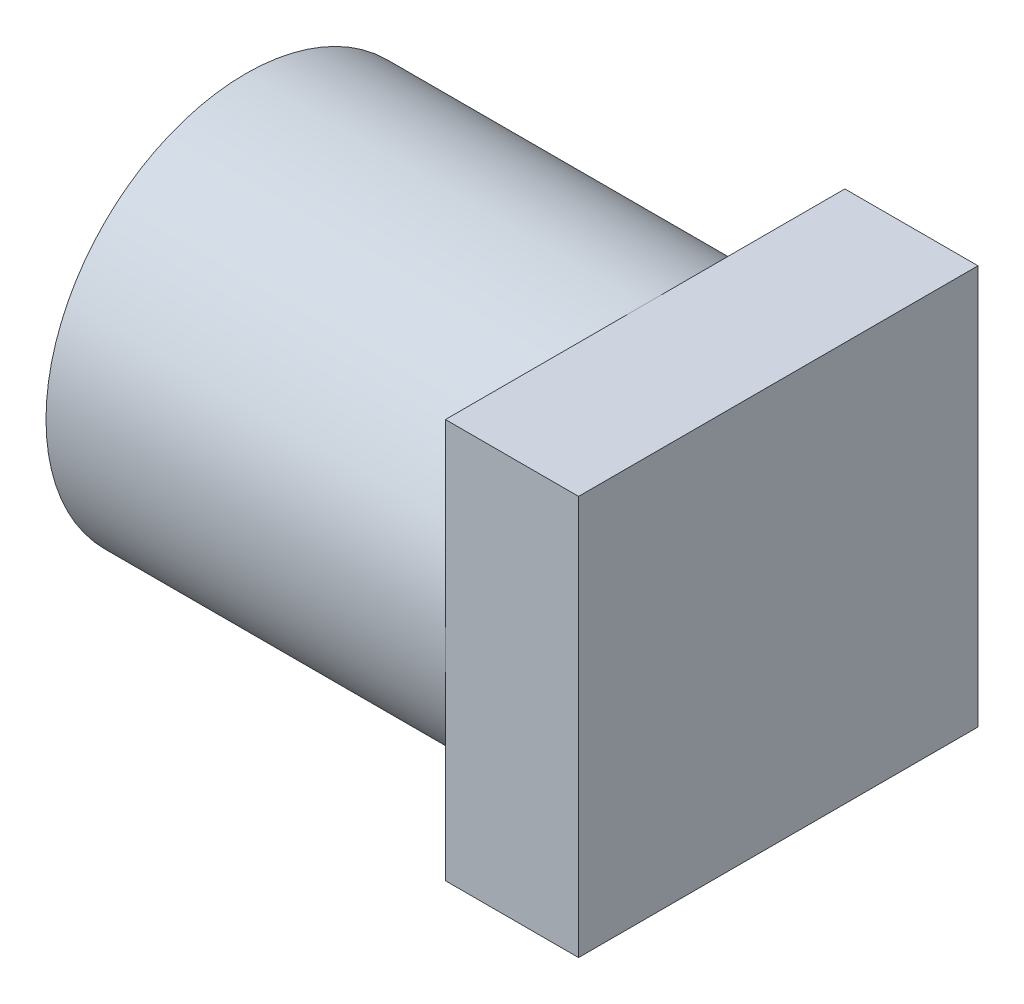
ISO-10303-21;
HEADER;
FILE_DESCRIPTION(('STEP AP214'),'2;1');
FILE_NAME('part.step','',(''),(''),'','','');
FILE_SCHEMA(('AUTOMOTIVE_DESIGN { 1 0 10303 214 1 1 1 1 }'));
ENDSEC;
DATA;
#1=APPLICATION_CONTEXT('core data for automotive mechanical design processes');
#2=APPLICATION_PROTOCOL_DEFINITION('international standard','automotive_design',2000,#1);
#3=PRODUCT_CONTEXT('',#1,'mechanical');
#4=PRODUCT('Part','Part','',(#3));
#5=PRODUCT_RELATED_PRODUCT_CATEGORY('part','',(#4));
#6=PRODUCT_DEFINITION_FORMATION('','',#4);
#7=PRODUCT_DEFINITION_CONTEXT('part definition',#1,'design');
#8=PRODUCT_DEFINITION('design','',#6,#7);
#9=PRODUCT_DEFINITION_SHAPE('','',#8);
#10=(LENGTH_UNIT() NAMED_UNIT(*) SI_UNIT(.MILLI.,.METRE.));
#11=(NAMED_UNIT(*) PLANE_ANGLE_UNIT() SI_UNIT($,.RADIAN.));
#12=(NAMED_UNIT(*) SI_UNIT($,.STERADIAN.) SOLID_ANGLE_UNIT());
#13=UNCERTAINTY_MEASURE_WITH_UNIT(LENGTH_MEASURE(1.E-05),#10,'distance_accuracy_value','');
#14=(GEOMETRIC_REPRESENTATION_CONTEXT(3) GLOBAL_UNCERTAINTY_ASSIGNED_CONTEXT((#13)) GLOBAL_UNIT_ASSIGNED_CONTEXT((#10,
#11,#12)) REPRESENTATION_CONTEXT('',''));
#15=CARTESIAN_POINT('',(0.,0.,0.));
#16=DIRECTION('',(0.,0.,1.));
#17=DIRECTION('',(1.,0.,0.));
#18=AXIS2_PLACEMENT_3D('',#15,#16,#17);
#19=CARTESIAN_POINT('',(30.,0.,0.));
#20=DIRECTION('',(-1.,0.,0.));
#21=DIRECTION('',(0.,0.,1.));
#22=AXIS2_PLACEMENT_3D('',#19,#20,#21);
#23=CYLINDRICAL_SURFACE('',#22,15.);
#24=CARTESIAN_POINT('',(30.,0.,0.));
#25=DIRECTION('',(1.,0.,0.));
#26=DIRECTION('',(0.,0.,-1.));
#27=AXIS2_PLACEMENT_3D('',#24,#25,#26);
#28=CIRCLE('',#27,15.);
#29=CARTESIAN_POINT('',(30.,0.,-15.));
#30=VERTEX_POINT('',#29);
#31=CARTESIAN_POINT('',(30.,15.,0.));
#32=VERTEX_POINT('',#31);
#33=EDGE_CURVE('E11',#30,#32,#28,.T.);
#34=ORIENTED_EDGE('',*,*,#33,.F.);
#35=CARTESIAN_POINT('',(30.,-15.,0.));
#36=VERTEX_POINT('',#35);
#37=EDGE_CURVE('E48',#36,#30,#28,.T.);
#38=ORIENTED_EDGE('',*,*,#37,.F.);
#39=CARTESIAN_POINT('',(30.,0.,15.));
#40=VERTEX_POINT('',#39);
#41=EDGE_CURVE('E58',#40,#36,#28,.T.);
#42=ORIENTED_EDGE('',*,*,#41,.F.);
#43=EDGE_CURVE('E47',#32,#40,#28,.T.);
#44=ORIENTED_EDGE('',*,*,#43,.F.);
#45=EDGE_LOOP('',(#34,#38,#42,#44));
#46=FACE_BOUND('',#45,.T.);
#47=CARTESIAN_POINT('',(0.,0.,0.));
#48=DIRECTION('',(1.,0.,0.));
#49=DIRECTION('',(0.,0.,-1.));
#50=AXIS2_PLACEMENT_3D('',#47,#48,#49);
#51=CIRCLE('',#50,15.);
#52=CARTESIAN_POINT('',(0.,0.,-15.));
#53=VERTEX_POINT('',#52);
#54=EDGE_CURVE('E42',#53,#53,#51,.T.);
#55=ORIENTED_EDGE('',*,*,#54,.T.);
#56=EDGE_LOOP('',(#55));
#57=FACE_BOUND('',#56,.T.);
#58=ADVANCED_FACE('F39',(#46,#57),#23,.T.);
#59=CARTESIAN_POINT('',(0.,0.,0.));
#60=DIRECTION('',(1.,0.,0.));
#61=DIRECTION('',(0.,0.,-1.));
#62=AXIS2_PLACEMENT_3D('',#59,#60,#61);
#63=PLANE('',#62);
#64=ORIENTED_EDGE('',*,*,#54,.F.);
#65=EDGE_LOOP('',(#64));
#66=FACE_BOUND('',#65,.T.);
#67=ADVANCED_FACE('F167',(#66),#63,.F.);
#68=CARTESIAN_POINT('',(30.,0.,0.));
#69=DIRECTION('',(1.,0.,0.));
#70=DIRECTION('',(0.,0.,-1.));
#71=AXIS2_PLACEMENT_3D('',#68,#69,#70);
#72=PLANE('',#71);
#73=DIRECTION('',(0.,1.,0.));
#74=VECTOR('',#73,1.);
#75=CARTESIAN_POINT('',(30.,15.,-15.));
#76=LINE('',#75,#74);
#77=CARTESIAN_POINT('',(30.,15.,-15.));
#78=VERTEX_POINT('',#77);
#79=EDGE_CURVE('E115',#30,#78,#76,.T.);
#80=ORIENTED_EDGE('',*,*,#79,.F.);
#81=ORIENTED_EDGE('',*,*,#33,.T.);
#82=DIRECTION('',(0.,0.,1.));
#83=VECTOR('',#82,1.);
#84=CARTESIAN_POINT('',(30.,15.,15.));
#85=LINE('',#84,#83);
#86=EDGE_CURVE('E133',#78,#32,#85,.T.);
#87=ORIENTED_EDGE('',*,*,#86,.F.);
#88=EDGE_LOOP('',(#80,#81,#87));
#89=FACE_BOUND('',#88,.T.);
#90=ADVANCED_FACE('F151',(#89),#72,.F.);
#91=CARTESIAN_POINT('',(30.,15.,15.));
#92=VERTEX_POINT('',#91);
#93=EDGE_CURVE('E135',#32,#92,#85,.T.);
#94=ORIENTED_EDGE('',*,*,#93,.F.);
#95=ORIENTED_EDGE('',*,*,#43,.T.);
#96=DIRECTION('',(0.,-1.,0.));
#97=VECTOR('',#96,1.);
#98=CARTESIAN_POINT('',(30.,15.,15.));
#99=LINE('',#98,#97);
#100=EDGE_CURVE('E129',#92,#40,#99,.T.);
#101=ORIENTED_EDGE('',*,*,#100,.F.);
#102=EDGE_LOOP('',(#94,#95,#101));
#103=FACE_BOUND('',#102,.T.);
#104=ADVANCED_FACE('F155',(#103),#72,.F.);
#105=CARTESIAN_POINT('',(30.,-15.,15.));
#106=VERTEX_POINT('',#105);
#107=EDGE_CURVE('E132',#40,#106,#99,.T.);
#108=ORIENTED_EDGE('',*,*,#107,.F.);
#109=ORIENTED_EDGE('',*,*,#41,.T.);
#110=DIRECTION('',(0.,0.,-1.));
#111=VECTOR('',#110,1.);
#112=CARTESIAN_POINT('',(30.,-15.,15.));
#113=LINE('',#112,#111);
#114=EDGE_CURVE('E110',#106,#36,#113,.T.);
#115=ORIENTED_EDGE('',*,*,#114,.F.);
#116=EDGE_LOOP('',(#108,#109,#115));
#117=FACE_BOUND('',#116,.T.);
#118=ADVANCED_FACE('F157',(#117),#72,.F.);
#119=CARTESIAN_POINT('',(30.,-15.,-15.));
#120=VERTEX_POINT('',#119);
#121=EDGE_CURVE('E128',#36,#120,#113,.T.);
#122=ORIENTED_EDGE('',*,*,#121,.F.);
#123=ORIENTED_EDGE('',*,*,#37,.T.);
#124=EDGE_CURVE('E136',#120,#30,#76,.T.);
#125=ORIENTED_EDGE('',*,*,#124,.F.);
#126=EDGE_LOOP('',(#122,#123,#125));
#127=FACE_BOUND('',#126,.T.);
#128=ADVANCED_FACE('F149',(#127),#72,.F.);
#129=CARTESIAN_POINT('',(40.,15.,-15.));
#130=DIRECTION('',(0.,0.,1.));
#131=DIRECTION('',(0.,-1.,0.));
#132=AXIS2_PLACEMENT_3D('',#129,#130,#131);
#133=PLANE('',#132);
#134=ORIENTED_EDGE('',*,*,#124,.T.);
#135=ORIENTED_EDGE('',*,*,#79,.T.);
#136=DIRECTION('',(-1.,0.,0.));
#137=VECTOR('',#136,1.);
#138=CARTESIAN_POINT('',(40.,15.,-15.));
#139=LINE('',#138,#137);
#140=CARTESIAN_POINT('',(40.,15.,-15.));
#141=VERTEX_POINT('',#140);
#142=EDGE_CURVE('E95',#141,#78,#139,.T.);
#143=ORIENTED_EDGE('',*,*,#142,.F.);
#144=DIRECTION('',(0.,1.,0.));
#145=VECTOR('',#144,1.);
#146=CARTESIAN_POINT('',(40.,15.,-15.));
#147=LINE('',#146,#145);
#148=CARTESIAN_POINT('',(40.,-15.,-15.));
#149=VERTEX_POINT('',#148);
#150=EDGE_CURVE('E101',#149,#141,#147,.T.);
#151=ORIENTED_EDGE('',*,*,#150,.F.);
#152=DIRECTION('',(-1.,0.,0.));
#153=VECTOR('',#152,1.);
#154=CARTESIAN_POINT('',(40.,-15.,-15.));
#155=LINE('',#154,#153);
#156=EDGE_CURVE('E124',#149,#120,#155,.T.);
#157=ORIENTED_EDGE('',*,*,#156,.T.);
#158=EDGE_LOOP('',(#134,#135,#143,#151,#157));
#159=FACE_BOUND('',#158,.T.);
#160=ADVANCED_FACE('F113',(#159),#133,.F.);
#161=CARTESIAN_POINT('',(40.,15.,15.));
#162=DIRECTION('',(0.,-1.,0.));
#163=DIRECTION('',(0.,0.,-1.));
#164=AXIS2_PLACEMENT_3D('',#161,#162,#163);
#165=PLANE('',#164);
#166=ORIENTED_EDGE('',*,*,#86,.T.);
#167=ORIENTED_EDGE('',*,*,#93,.T.);
#168=DIRECTION('',(-1.,0.,0.));
#169=VECTOR('',#168,1.);
#170=CARTESIAN_POINT('',(40.,15.,15.));
#171=LINE('',#170,#169);
#172=CARTESIAN_POINT('',(40.,15.,15.));
#173=VERTEX_POINT('',#172);
#174=EDGE_CURVE('E97',#173,#92,#171,.T.);
#175=ORIENTED_EDGE('',*,*,#174,.F.);
#176=DIRECTION('',(0.,0.,1.));
#177=VECTOR('',#176,1.);
#178=CARTESIAN_POINT('',(40.,15.,15.));
#179=LINE('',#178,#177);
#180=EDGE_CURVE('E90',#141,#173,#179,.T.);
#181=ORIENTED_EDGE('',*,*,#180,.F.);
#182=ORIENTED_EDGE('',*,*,#142,.T.);
#183=EDGE_LOOP('',(#166,#167,#175,#181,#182));
#184=FACE_BOUND('',#183,.T.);
#185=ADVANCED_FACE('F93',(#184),#165,.F.);
#186=CARTESIAN_POINT('',(40.,15.,15.));
#187=DIRECTION('',(0.,0.,-1.));
#188=DIRECTION('',(0.,1.,0.));
#189=AXIS2_PLACEMENT_3D('',#186,#187,#188);
#190=PLANE('',#189);
#191=ORIENTED_EDGE('',*,*,#100,.T.);
#192=ORIENTED_EDGE('',*,*,#107,.T.);
#193=DIRECTION('',(-1.,0.,0.));
#194=VECTOR('',#193,1.);
#195=CARTESIAN_POINT('',(40.,-15.,15.));
#196=LINE('',#195,#194);
#197=CARTESIAN_POINT('',(40.,-15.,15.));
#198=VERTEX_POINT('',#197);
#199=EDGE_CURVE('E119',#198,#106,#196,.T.);
#200=ORIENTED_EDGE('',*,*,#199,.F.);
#201=DIRECTION('',(0.,-1.,0.));
#202=VECTOR('',#201,1.);
#203=CARTESIAN_POINT('',(40.,15.,15.));
#204=LINE('',#203,#202);
#205=EDGE_CURVE('E100',#173,#198,#204,.T.);
#206=ORIENTED_EDGE('',*,*,#205,.F.);
#207=ORIENTED_EDGE('',*,*,#174,.T.);
#208=EDGE_LOOP('',(#191,#192,#200,#206,#207));
#209=FACE_BOUND('',#208,.T.);
#210=ADVANCED_FACE('F141',(#209),#190,.F.);
#211=CARTESIAN_POINT('',(40.,-15.,15.));
#212=DIRECTION('',(0.,1.,0.));
#213=DIRECTION('',(0.,0.,1.));
#214=AXIS2_PLACEMENT_3D('',#211,#212,#213);
#215=PLANE('',#214);
#216=ORIENTED_EDGE('',*,*,#114,.T.);
#217=ORIENTED_EDGE('',*,*,#121,.T.);
#218=ORIENTED_EDGE('',*,*,#156,.F.);
#219=DIRECTION('',(0.,0.,-1.));
#220=VECTOR('',#219,1.);
#221=CARTESIAN_POINT('',(40.,-15.,15.));
#222=LINE('',#221,#220);
#223=EDGE_CURVE('E106',#198,#149,#222,.T.);
#224=ORIENTED_EDGE('',*,*,#223,.F.);
#225=ORIENTED_EDGE('',*,*,#199,.T.);
#226=EDGE_LOOP('',(#216,#217,#218,#224,#225));
#227=FACE_BOUND('',#226,.T.);
#228=ADVANCED_FACE('F145',(#227),#215,.F.);
#229=CARTESIAN_POINT('',(40.,0.,0.));
#230=DIRECTION('',(1.,0.,0.));
#231=DIRECTION('',(0.,0.,-1.));
#232=AXIS2_PLACEMENT_3D('',#229,#230,#231);
#233=PLANE('',#232);
#234=ORIENTED_EDGE('',*,*,#150,.T.);
#235=ORIENTED_EDGE('',*,*,#180,.T.);
#236=ORIENTED_EDGE('',*,*,#205,.T.);
#237=ORIENTED_EDGE('',*,*,#223,.T.);
#238=EDGE_LOOP('',(#234,#235,#236,#237));
#239=FACE_BOUND('',#238,.T.);
#240=ADVANCED_FACE('F104',(#239),#233,.T.);
#241=CLOSED_SHELL('',(#58,#67,#90,#104,#118,#128,#160,#185,#210,#228,#240));
#242=MANIFOLD_SOLID_BREP('B2',#241);
#243=ADVANCED_BREP_SHAPE_REPRESENTATION('',(#18,#242),#14);
#244=SHAPE_DEFINITION_REPRESENTATION(#9,#243);
ENDSEC;
END-ISO-10303-21;
